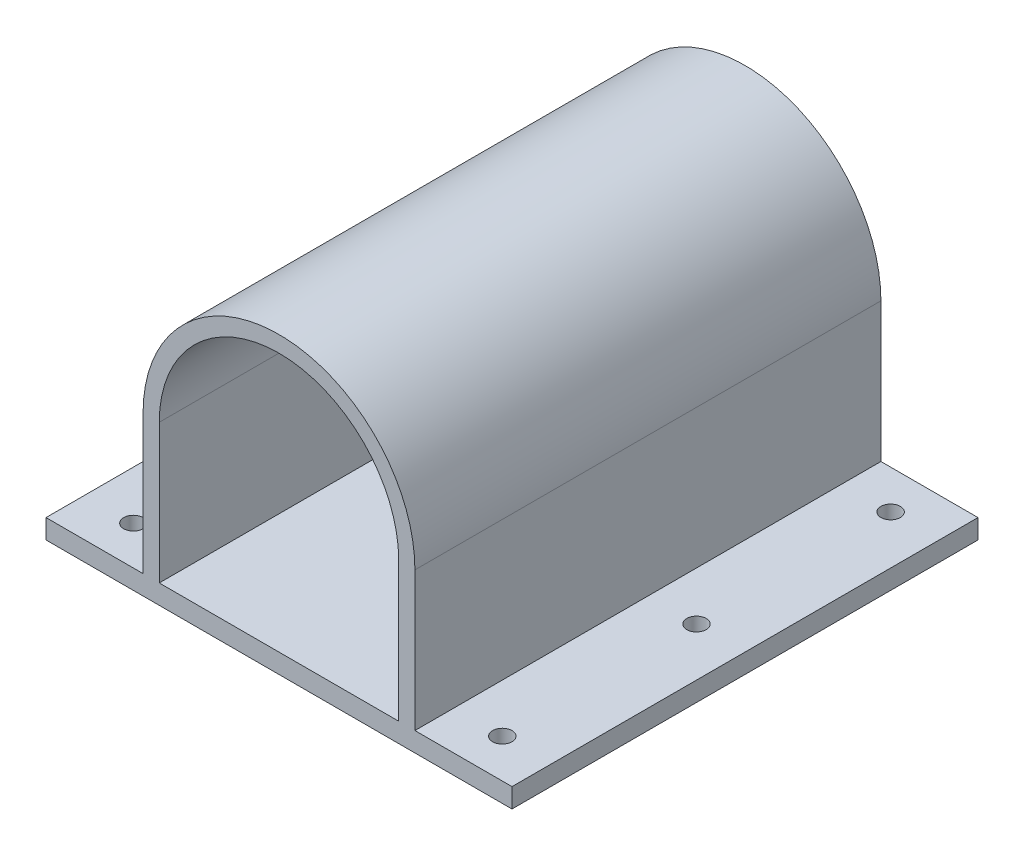
ISO-10303-21;
HEADER;
FILE_DESCRIPTION(('STEP AP214'),'2;1');
FILE_NAME('part.step','',(''),(''),'','','');
FILE_SCHEMA(('AUTOMOTIVE_DESIGN { 1 0 10303 214 1 1 1 1 }'));
ENDSEC;
DATA;
#1=APPLICATION_CONTEXT('core data for automotive mechanical design processes');
#2=APPLICATION_PROTOCOL_DEFINITION('international standard','automotive_design',2000,#1);
#3=PRODUCT_CONTEXT('',#1,'mechanical');
#4=PRODUCT('Part','Part','',(#3));
#5=PRODUCT_RELATED_PRODUCT_CATEGORY('part','',(#4));
#6=PRODUCT_DEFINITION_FORMATION('','',#4);
#7=PRODUCT_DEFINITION_CONTEXT('part definition',#1,'design');
#8=PRODUCT_DEFINITION('design','',#6,#7);
#9=PRODUCT_DEFINITION_SHAPE('','',#8);
#10=(LENGTH_UNIT() NAMED_UNIT(*) SI_UNIT(.MILLI.,.METRE.));
#11=(NAMED_UNIT(*) PLANE_ANGLE_UNIT() SI_UNIT($,.RADIAN.));
#12=(NAMED_UNIT(*) SI_UNIT($,.STERADIAN.) SOLID_ANGLE_UNIT());
#13=UNCERTAINTY_MEASURE_WITH_UNIT(LENGTH_MEASURE(1.E-05),#10,'distance_accuracy_value','');
#14=(GEOMETRIC_REPRESENTATION_CONTEXT(3) GLOBAL_UNCERTAINTY_ASSIGNED_CONTEXT((#13)) GLOBAL_UNIT_ASSIGNED_CONTEXT((#10,
#11,#12)) REPRESENTATION_CONTEXT('',''));
#15=CARTESIAN_POINT('',(0.,0.,0.));
#16=DIRECTION('',(0.,0.,1.));
#17=DIRECTION('',(1.,0.,0.));
#18=AXIS2_PLACEMENT_3D('',#15,#16,#17);
#19=CARTESIAN_POINT('',(0.,-15.5,72.));
#20=DIRECTION('',(0.,0.,-1.));
#21=DIRECTION('',(-1.,0.,0.));
#22=AXIS2_PLACEMENT_3D('',#19,#20,#21);
#23=CYLINDRICAL_SURFACE('',#22,1.65);
#24=CARTESIAN_POINT('',(0.,-15.5,0.));
#25=DIRECTION('',(0.,0.,1.));
#26=DIRECTION('',(1.,0.,0.));
#27=AXIS2_PLACEMENT_3D('',#24,#25,#26);
#28=CIRCLE('',#27,1.65);
#29=CARTESIAN_POINT('',(1.65000000000006,-15.5,0.));
#30=VERTEX_POINT('',#29);
#31=EDGE_CURVE('E216',#30,#30,#28,.T.);
#32=ORIENTED_EDGE('',*,*,#31,.F.);
#33=EDGE_LOOP('',(#32));
#34=FACE_BOUND('',#33,.T.);
#35=CARTESIAN_POINT('',(0.,-15.5,15.));
#36=DIRECTION('',(0.,0.,1.));
#37=DIRECTION('',(1.,0.,0.));
#38=AXIS2_PLACEMENT_3D('',#35,#36,#37);
#39=CIRCLE('',#38,1.65);
#40=CARTESIAN_POINT('',(1.65000000000006,-15.5,15.));
#41=VERTEX_POINT('',#40);
#42=EDGE_CURVE('E195',#41,#41,#39,.T.);
#43=ORIENTED_EDGE('',*,*,#42,.T.);
#44=EDGE_LOOP('',(#43));
#45=FACE_BOUND('',#44,.T.);
#46=ADVANCED_FACE('F39',(#34,#45),#23,.F.);
#47=CARTESIAN_POINT('',(-7.,0.,72.));
#48=DIRECTION('',(0.,0.,-1.));
#49=DIRECTION('',(-1.,0.,0.));
#50=AXIS2_PLACEMENT_3D('',#47,#48,#49);
#51=CYLINDRICAL_SURFACE('',#50,6.15);
#52=CARTESIAN_POINT('',(-7.,0.,0.));
#53=DIRECTION('',(0.,0.,1.));
#54=DIRECTION('',(1.,0.,0.));
#55=AXIS2_PLACEMENT_3D('',#52,#53,#54);
#56=CIRCLE('',#55,6.15);
#57=CARTESIAN_POINT('',(-0.85,0.,0.));
#58=VERTEX_POINT('',#57);
#59=EDGE_CURVE('E213',#58,#58,#56,.T.);
#60=ORIENTED_EDGE('',*,*,#59,.F.);
#61=EDGE_LOOP('',(#60));
#62=FACE_BOUND('',#61,.T.);
#63=CARTESIAN_POINT('',(-7.,0.,15.));
#64=DIRECTION('',(0.,0.,1.));
#65=DIRECTION('',(1.,0.,0.));
#66=AXIS2_PLACEMENT_3D('',#63,#64,#65);
#67=CIRCLE('',#66,6.15);
#68=CARTESIAN_POINT('',(-0.85,0.,15.));
#69=VERTEX_POINT('',#68);
#70=EDGE_CURVE('E192',#69,#69,#67,.T.);
#71=ORIENTED_EDGE('',*,*,#70,.T.);
#72=EDGE_LOOP('',(#71));
#73=FACE_BOUND('',#72,.T.);
#74=ADVANCED_FACE('F308',(#62,#73),#51,.F.);
#75=CARTESIAN_POINT('',(-13.4233937586588,-7.75000000000005,72.));
#76=DIRECTION('',(0.,0.,-1.));
#77=DIRECTION('',(-1.,0.,0.));
#78=AXIS2_PLACEMENT_3D('',#75,#76,#77);
#79=CYLINDRICAL_SURFACE('',#78,1.65);
#80=CARTESIAN_POINT('',(-13.4233937586588,-7.75000000000005,0.));
#81=DIRECTION('',(0.,0.,1.));
#82=DIRECTION('',(1.,0.,0.));
#83=AXIS2_PLACEMENT_3D('',#80,#81,#82);
#84=CIRCLE('',#83,1.65);
#85=CARTESIAN_POINT('',(-11.7733937586588,-7.75000000000005,0.));
#86=VERTEX_POINT('',#85);
#87=EDGE_CURVE('E210',#86,#86,#84,.T.);
#88=ORIENTED_EDGE('',*,*,#87,.F.);
#89=EDGE_LOOP('',(#88));
#90=FACE_BOUND('',#89,.T.);
#91=CARTESIAN_POINT('',(-13.4233937586588,-7.75000000000005,15.));
#92=DIRECTION('',(0.,0.,1.));
#93=DIRECTION('',(1.,0.,0.));
#94=AXIS2_PLACEMENT_3D('',#91,#92,#93);
#95=CIRCLE('',#94,1.65);
#96=CARTESIAN_POINT('',(-11.7733937586588,-7.75000000000005,15.));
#97=VERTEX_POINT('',#96);
#98=EDGE_CURVE('E189',#97,#97,#95,.T.);
#99=ORIENTED_EDGE('',*,*,#98,.T.);
#100=EDGE_LOOP('',(#99));
#101=FACE_BOUND('',#100,.T.);
#102=ADVANCED_FACE('F315',(#90,#101),#79,.F.);
#103=CARTESIAN_POINT('',(-13.4233937586588,7.74999999999994,72.));
#104=DIRECTION('',(0.,0.,-1.));
#105=DIRECTION('',(-1.,0.,0.));
#106=AXIS2_PLACEMENT_3D('',#103,#104,#105);
#107=CYLINDRICAL_SURFACE('',#106,1.65);
#108=CARTESIAN_POINT('',(-13.4233937586588,7.74999999999994,0.));
#109=DIRECTION('',(0.,0.,1.));
#110=DIRECTION('',(1.,0.,0.));
#111=AXIS2_PLACEMENT_3D('',#108,#109,#110);
#112=CIRCLE('',#111,1.65);
#113=CARTESIAN_POINT('',(-11.7733937586588,7.74999999999994,0.));
#114=VERTEX_POINT('',#113);
#115=EDGE_CURVE('E207',#114,#114,#112,.T.);
#116=ORIENTED_EDGE('',*,*,#115,.F.);
#117=EDGE_LOOP('',(#116));
#118=FACE_BOUND('',#117,.T.);
#119=CARTESIAN_POINT('',(-13.4233937586588,7.74999999999994,15.));
#120=DIRECTION('',(0.,0.,1.));
#121=DIRECTION('',(1.,0.,0.));
#122=AXIS2_PLACEMENT_3D('',#119,#120,#121);
#123=CIRCLE('',#122,1.65);
#124=CARTESIAN_POINT('',(-11.7733937586588,7.74999999999994,15.));
#125=VERTEX_POINT('',#124);
#126=EDGE_CURVE('E186',#125,#125,#123,.T.);
#127=ORIENTED_EDGE('',*,*,#126,.T.);
#128=EDGE_LOOP('',(#127));
#129=FACE_BOUND('',#128,.T.);
#130=ADVANCED_FACE('F420',(#118,#129),#107,.F.);
#131=CARTESIAN_POINT('',(0.,15.5,72.));
#132=DIRECTION('',(0.,0.,-1.));
#133=DIRECTION('',(-1.,0.,0.));
#134=AXIS2_PLACEMENT_3D('',#131,#132,#133);
#135=CYLINDRICAL_SURFACE('',#134,1.65);
#136=CARTESIAN_POINT('',(0.,15.5,0.));
#137=DIRECTION('',(0.,0.,1.));
#138=DIRECTION('',(1.,0.,0.));
#139=AXIS2_PLACEMENT_3D('',#136,#137,#138);
#140=CIRCLE('',#139,1.65);
#141=CARTESIAN_POINT('',(1.64999999999994,15.5,0.));
#142=VERTEX_POINT('',#141);
#143=EDGE_CURVE('E204',#142,#142,#140,.T.);
#144=ORIENTED_EDGE('',*,*,#143,.F.);
#145=EDGE_LOOP('',(#144));
#146=FACE_BOUND('',#145,.T.);
#147=CARTESIAN_POINT('',(0.,15.5,15.));
#148=DIRECTION('',(0.,0.,1.));
#149=DIRECTION('',(1.,0.,0.));
#150=AXIS2_PLACEMENT_3D('',#147,#148,#149);
#151=CIRCLE('',#150,1.65);
#152=CARTESIAN_POINT('',(1.64999999999994,15.5,15.));
#153=VERTEX_POINT('',#152);
#154=EDGE_CURVE('E183',#153,#153,#151,.T.);
#155=ORIENTED_EDGE('',*,*,#154,.T.);
#156=EDGE_LOOP('',(#155));
#157=FACE_BOUND('',#156,.T.);
#158=ADVANCED_FACE('F416',(#146,#157),#135,.F.);
#159=CARTESIAN_POINT('',(13.4233937586588,7.75000000000006,72.));
#160=DIRECTION('',(0.,0.,-1.));
#161=DIRECTION('',(-1.,0.,0.));
#162=AXIS2_PLACEMENT_3D('',#159,#160,#161);
#163=CYLINDRICAL_SURFACE('',#162,1.65);
#164=CARTESIAN_POINT('',(13.4233937586588,7.75000000000006,0.));
#165=DIRECTION('',(0.,0.,1.));
#166=DIRECTION('',(1.,0.,0.));
#167=AXIS2_PLACEMENT_3D('',#164,#165,#166);
#168=CIRCLE('',#167,1.65);
#169=CARTESIAN_POINT('',(15.0733937586588,7.75000000000006,0.));
#170=VERTEX_POINT('',#169);
#171=EDGE_CURVE('E201',#170,#170,#168,.T.);
#172=ORIENTED_EDGE('',*,*,#171,.F.);
#173=EDGE_LOOP('',(#172));
#174=FACE_BOUND('',#173,.T.);
#175=CARTESIAN_POINT('',(13.4233937586588,7.75000000000006,15.));
#176=DIRECTION('',(0.,0.,1.));
#177=DIRECTION('',(1.,0.,0.));
#178=AXIS2_PLACEMENT_3D('',#175,#176,#177);
#179=CIRCLE('',#178,1.65);
#180=CARTESIAN_POINT('',(15.0733937586588,7.75000000000006,15.));
#181=VERTEX_POINT('',#180);
#182=EDGE_CURVE('E180',#181,#181,#179,.T.);
#183=ORIENTED_EDGE('',*,*,#182,.T.);
#184=EDGE_LOOP('',(#183));
#185=FACE_BOUND('',#184,.T.);
#186=ADVANCED_FACE('F382',(#174,#185),#163,.F.);
#187=CARTESIAN_POINT('',(13.4233937586588,-7.74999999999995,72.));
#188=DIRECTION('',(0.,0.,-1.));
#189=DIRECTION('',(-1.,0.,0.));
#190=AXIS2_PLACEMENT_3D('',#187,#188,#189);
#191=CYLINDRICAL_SURFACE('',#190,1.65);
#192=CARTESIAN_POINT('',(13.4233937586588,-7.74999999999995,0.));
#193=DIRECTION('',(0.,0.,1.));
#194=DIRECTION('',(1.,0.,0.));
#195=AXIS2_PLACEMENT_3D('',#192,#193,#194);
#196=CIRCLE('',#195,1.65);
#197=CARTESIAN_POINT('',(15.0733937586588,-7.74999999999995,0.));
#198=VERTEX_POINT('',#197);
#199=EDGE_CURVE('E198',#198,#198,#196,.T.);
#200=ORIENTED_EDGE('',*,*,#199,.F.);
#201=EDGE_LOOP('',(#200));
#202=FACE_BOUND('',#201,.T.);
#203=CARTESIAN_POINT('',(13.4233937586588,-7.74999999999995,15.));
#204=DIRECTION('',(0.,0.,1.));
#205=DIRECTION('',(1.,0.,0.));
#206=AXIS2_PLACEMENT_3D('',#203,#204,#205);
#207=CIRCLE('',#206,1.65);
#208=CARTESIAN_POINT('',(15.0733937586588,-7.74999999999995,15.));
#209=VERTEX_POINT('',#208);
#210=EDGE_CURVE('E176',#209,#209,#207,.T.);
#211=ORIENTED_EDGE('',*,*,#210,.T.);
#212=EDGE_LOOP('',(#211));
#213=FACE_BOUND('',#212,.T.);
#214=ADVANCED_FACE('F325',(#202,#213),#191,.F.);
#215=CARTESIAN_POINT('',(0.,0.,72.));
#216=DIRECTION('',(0.,0.,1.));
#217=DIRECTION('',(1.,0.,0.));
#218=AXIS2_PLACEMENT_3D('',#215,#216,#217);
#219=PLANE('',#218);
#220=CARTESIAN_POINT('',(0.,0.,72.));
#221=DIRECTION('',(0.,0.,1.));
#222=DIRECTION('',(1.,0.,0.));
#223=AXIS2_PLACEMENT_3D('',#220,#221,#222);
#224=CIRCLE('',#223,18.5);
#225=CARTESIAN_POINT('',(18.5,0.,72.));
#226=VERTEX_POINT('',#225);
#227=CARTESIAN_POINT('',(-18.5,0.,72.));
#228=VERTEX_POINT('',#227);
#229=EDGE_CURVE('E140',#226,#228,#224,.T.);
#230=ORIENTED_EDGE('',*,*,#229,.F.);
#231=DIRECTION('',(0.,1.,0.));
#232=VECTOR('',#231,1.);
#233=CARTESIAN_POINT('',(18.5,-21.5,72.));
#234=LINE('',#233,#232);
#235=CARTESIAN_POINT('',(18.5,-21.5,72.));
#236=VERTEX_POINT('',#235);
#237=EDGE_CURVE('E157',#236,#226,#234,.T.);
#238=ORIENTED_EDGE('',*,*,#237,.F.);
#239=DIRECTION('',(1.,0.,0.));
#240=VECTOR('',#239,1.);
#241=CARTESIAN_POINT('',(-18.5,-21.5,72.));
#242=LINE('',#241,#240);
#243=CARTESIAN_POINT('',(-18.5,-21.5,72.));
#244=VERTEX_POINT('',#243);
#245=EDGE_CURVE('E160',#244,#236,#242,.T.);
#246=ORIENTED_EDGE('',*,*,#245,.F.);
#247=DIRECTION('',(0.,-1.,0.));
#248=VECTOR('',#247,1.);
#249=CARTESIAN_POINT('',(-18.5,0.,72.));
#250=LINE('',#249,#248);
#251=EDGE_CURVE('E169',#228,#244,#250,.T.);
#252=ORIENTED_EDGE('',*,*,#251,.F.);
#253=EDGE_LOOP('',(#230,#238,#246,#252));
#254=FACE_BOUND('',#253,.T.);
#255=CARTESIAN_POINT('',(0.,0.,72.));
#256=DIRECTION('',(0.,0.,1.));
#257=DIRECTION('',(1.,0.,0.));
#258=AXIS2_PLACEMENT_3D('',#255,#256,#257);
#259=CIRCLE('',#258,21.);
#260=CARTESIAN_POINT('',(21.,0.,72.));
#261=VERTEX_POINT('',#260);
#262=CARTESIAN_POINT('',(-21.,0.,72.));
#263=VERTEX_POINT('',#262);
#264=EDGE_CURVE('E220',#261,#263,#259,.T.);
#265=ORIENTED_EDGE('',*,*,#264,.T.);
#266=DIRECTION('',(0.,-1.,0.));
#267=VECTOR('',#266,1.);
#268=CARTESIAN_POINT('',(-21.,0.,72.));
#269=LINE('',#268,#267);
#270=CARTESIAN_POINT('',(-21.,-21.5,72.));
#271=VERTEX_POINT('',#270);
#272=EDGE_CURVE('E223',#263,#271,#269,.T.);
#273=ORIENTED_EDGE('',*,*,#272,.T.);
#274=DIRECTION('',(-1.,0.,0.));
#275=VECTOR('',#274,1.);
#276=CARTESIAN_POINT('',(-21.,-21.5,72.));
#277=LINE('',#276,#275);
#278=CARTESIAN_POINT('',(-36.,-21.5,72.));
#279=VERTEX_POINT('',#278);
#280=EDGE_CURVE('E226',#271,#279,#277,.T.);
#281=ORIENTED_EDGE('',*,*,#280,.T.);
#282=DIRECTION('',(0.,-1.,0.));
#283=VECTOR('',#282,1.);
#284=CARTESIAN_POINT('',(-36.,-21.5,72.));
#285=LINE('',#284,#283);
#286=CARTESIAN_POINT('',(-36.,-24.5,72.));
#287=VERTEX_POINT('',#286);
#288=EDGE_CURVE('E228',#279,#287,#285,.T.);
#289=ORIENTED_EDGE('',*,*,#288,.T.);
#290=DIRECTION('',(1.,0.,0.));
#291=VECTOR('',#290,1.);
#292=CARTESIAN_POINT('',(-36.,-24.5,72.));
#293=LINE('',#292,#291);
#294=CARTESIAN_POINT('',(36.,-24.5,72.));
#295=VERTEX_POINT('',#294);
#296=EDGE_CURVE('E230',#287,#295,#293,.T.);
#297=ORIENTED_EDGE('',*,*,#296,.T.);
#298=DIRECTION('',(0.,1.,0.));
#299=VECTOR('',#298,1.);
#300=CARTESIAN_POINT('',(36.,-24.5,72.));
#301=LINE('',#300,#299);
#302=CARTESIAN_POINT('',(36.,-21.5,72.));
#303=VERTEX_POINT('',#302);
#304=EDGE_CURVE('E232',#295,#303,#301,.T.);
#305=ORIENTED_EDGE('',*,*,#304,.T.);
#306=DIRECTION('',(-1.,0.,0.));
#307=VECTOR('',#306,1.);
#308=CARTESIAN_POINT('',(36.,-21.5,72.));
#309=LINE('',#308,#307);
#310=CARTESIAN_POINT('',(21.,-21.5,72.));
#311=VERTEX_POINT('',#310);
#312=EDGE_CURVE('E234',#303,#311,#309,.T.);
#313=ORIENTED_EDGE('',*,*,#312,.T.);
#314=DIRECTION('',(0.,1.,0.));
#315=VECTOR('',#314,1.);
#316=CARTESIAN_POINT('',(21.,-21.5,72.));
#317=LINE('',#316,#315);
#318=EDGE_CURVE('E236',#311,#261,#317,.T.);
#319=ORIENTED_EDGE('',*,*,#318,.T.);
#320=EDGE_LOOP('',(#265,#273,#281,#289,#297,#305,#313,#319));
#321=FACE_BOUND('',#320,.T.);
#322=ADVANCED_FACE('F292',(#254,#321),#219,.T.);
#323=CARTESIAN_POINT('',(0.,0.,0.));
#324=DIRECTION('',(0.,0.,1.));
#325=DIRECTION('',(1.,0.,0.));
#326=AXIS2_PLACEMENT_3D('',#323,#324,#325);
#327=PLANE('',#326);
#328=DIRECTION('',(1.,0.,0.));
#329=VECTOR('',#328,1.);
#330=CARTESIAN_POINT('',(-36.,-24.5,0.));
#331=LINE('',#330,#329);
#332=CARTESIAN_POINT('',(-30.,-24.5,0.));
#333=VERTEX_POINT('',#332);
#334=CARTESIAN_POINT('',(36.,-24.5,0.));
#335=VERTEX_POINT('',#334);
#336=EDGE_CURVE('E245',#333,#335,#331,.T.);
#337=ORIENTED_EDGE('',*,*,#336,.F.);
#338=DIRECTION('',(0.,-1.,0.));
#339=VECTOR('',#338,1.);
#340=CARTESIAN_POINT('',(-30.,0.,0.));
#341=LINE('',#340,#339);
#342=CARTESIAN_POINT('',(-30.,-21.5,0.));
#343=VERTEX_POINT('',#342);
#344=EDGE_CURVE('E47',#333,#343,#341,.F.);
#345=ORIENTED_EDGE('',*,*,#344,.T.);
#346=DIRECTION('',(-1.,0.,0.));
#347=VECTOR('',#346,1.);
#348=CARTESIAN_POINT('',(-21.,-21.5,0.));
#349=LINE('',#348,#347);
#350=CARTESIAN_POINT('',(-21.,-21.5,0.));
#351=VERTEX_POINT('',#350);
#352=EDGE_CURVE('E243',#351,#343,#349,.T.);
#353=ORIENTED_EDGE('',*,*,#352,.F.);
#354=DIRECTION('',(0.,-1.,0.));
#355=VECTOR('',#354,1.);
#356=CARTESIAN_POINT('',(-21.,0.,0.));
#357=LINE('',#356,#355);
#358=CARTESIAN_POINT('',(-21.,0.,0.));
#359=VERTEX_POINT('',#358);
#360=EDGE_CURVE('E241',#359,#351,#357,.T.);
#361=ORIENTED_EDGE('',*,*,#360,.F.);
#362=CARTESIAN_POINT('',(0.,0.,0.));
#363=DIRECTION('',(0.,0.,1.));
#364=DIRECTION('',(1.,0.,0.));
#365=AXIS2_PLACEMENT_3D('',#362,#363,#364);
#366=CIRCLE('',#365,21.);
#367=CARTESIAN_POINT('',(21.,0.,0.));
#368=VERTEX_POINT('',#367);
#369=EDGE_CURVE('E219',#368,#359,#366,.T.);
#370=ORIENTED_EDGE('',*,*,#369,.F.);
#371=DIRECTION('',(0.,1.,0.));
#372=VECTOR('',#371,1.);
#373=CARTESIAN_POINT('',(21.,-21.5,0.));
#374=LINE('',#373,#372);
#375=CARTESIAN_POINT('',(21.,-21.5,0.));
#376=VERTEX_POINT('',#375);
#377=EDGE_CURVE('E224',#376,#368,#374,.T.);
#378=ORIENTED_EDGE('',*,*,#377,.F.);
#379=DIRECTION('',(-1.,0.,0.));
#380=VECTOR('',#379,1.);
#381=CARTESIAN_POINT('',(36.,-21.5,0.));
#382=LINE('',#381,#380);
#383=CARTESIAN_POINT('',(36.,-21.5,0.));
#384=VERTEX_POINT('',#383);
#385=EDGE_CURVE('E249',#384,#376,#382,.T.);
#386=ORIENTED_EDGE('',*,*,#385,.F.);
#387=DIRECTION('',(0.,1.,0.));
#388=VECTOR('',#387,1.);
#389=CARTESIAN_POINT('',(36.,-24.5,0.));
#390=LINE('',#389,#388);
#391=EDGE_CURVE('E247',#335,#384,#390,.T.);
#392=ORIENTED_EDGE('',*,*,#391,.F.);
#393=EDGE_LOOP('',(#337,#345,#353,#361,#370,#378,#386,#392));
#394=FACE_BOUND('',#393,.T.);
#395=ORIENTED_EDGE('',*,*,#31,.T.);
#396=EDGE_LOOP('',(#395));
#397=FACE_BOUND('',#396,.T.);
#398=ORIENTED_EDGE('',*,*,#59,.T.);
#399=EDGE_LOOP('',(#398));
#400=FACE_BOUND('',#399,.T.);
#401=ORIENTED_EDGE('',*,*,#87,.T.);
#402=EDGE_LOOP('',(#401));
#403=FACE_BOUND('',#402,.T.);
#404=ORIENTED_EDGE('',*,*,#115,.T.);
#405=EDGE_LOOP('',(#404));
#406=FACE_BOUND('',#405,.T.);
#407=ORIENTED_EDGE('',*,*,#143,.T.);
#408=EDGE_LOOP('',(#407));
#409=FACE_BOUND('',#408,.T.);
#410=ORIENTED_EDGE('',*,*,#171,.T.);
#411=EDGE_LOOP('',(#410));
#412=FACE_BOUND('',#411,.T.);
#413=ORIENTED_EDGE('',*,*,#199,.T.);
#414=EDGE_LOOP('',(#413));
#415=FACE_BOUND('',#414,.T.);
#416=ADVANCED_FACE('F324',(#394,#397,#400,#403,#406,#409,#412,#415),#327,.F.);
#417=CARTESIAN_POINT('',(0.,0.,72.));
#418=DIRECTION('',(0.,0.,-1.));
#419=DIRECTION('',(-1.,0.,0.));
#420=AXIS2_PLACEMENT_3D('',#417,#418,#419);
#421=CYLINDRICAL_SURFACE('',#420,21.);
#422=ORIENTED_EDGE('',*,*,#369,.T.);
#423=DIRECTION('',(0.,0.,-1.));
#424=VECTOR('',#423,1.);
#425=CARTESIAN_POINT('',(-21.,0.,72.));
#426=LINE('',#425,#424);
#427=EDGE_CURVE('E271',#263,#359,#426,.T.);
#428=ORIENTED_EDGE('',*,*,#427,.F.);
#429=ORIENTED_EDGE('',*,*,#264,.F.);
#430=DIRECTION('',(0.,0.,-1.));
#431=VECTOR('',#430,1.);
#432=CARTESIAN_POINT('',(21.,0.,72.));
#433=LINE('',#432,#431);
#434=EDGE_CURVE('E238',#261,#368,#433,.T.);
#435=ORIENTED_EDGE('',*,*,#434,.T.);
#436=EDGE_LOOP('',(#422,#428,#429,#435));
#437=FACE_BOUND('',#436,.T.);
#438=ADVANCED_FACE('F329',(#437),#421,.T.);
#439=CARTESIAN_POINT('',(-21.,0.,72.));
#440=DIRECTION('',(1.,0.,0.));
#441=DIRECTION('',(0.,1.,0.));
#442=AXIS2_PLACEMENT_3D('',#439,#440,#441);
#443=PLANE('',#442);
#444=ORIENTED_EDGE('',*,*,#360,.T.);
#445=DIRECTION('',(0.,0.,-1.));
#446=VECTOR('',#445,1.);
#447=CARTESIAN_POINT('',(-21.,-21.5,72.));
#448=LINE('',#447,#446);
#449=EDGE_CURVE('E268',#271,#351,#448,.T.);
#450=ORIENTED_EDGE('',*,*,#449,.F.);
#451=ORIENTED_EDGE('',*,*,#272,.F.);
#452=ORIENTED_EDGE('',*,*,#427,.T.);
#453=EDGE_LOOP('',(#444,#450,#451,#452));
#454=FACE_BOUND('',#453,.T.);
#455=ADVANCED_FACE('F347',(#454),#443,.F.);
#456=CARTESIAN_POINT('',(-21.,-21.5,72.));
#457=DIRECTION('',(0.,-1.,0.));
#458=DIRECTION('',(0.,0.,-1.));
#459=AXIS2_PLACEMENT_3D('',#456,#457,#458);
#460=PLANE('',#459);
#461=CARTESIAN_POINT('',(-28.5,-21.5,6.));
#462=DIRECTION('',(0.,1.,0.));
#463=DIRECTION('',(0.,0.,1.));
#464=AXIS2_PLACEMENT_3D('',#461,#462,#463);
#465=CIRCLE('',#464,1.5);
#466=CARTESIAN_POINT('',(-28.5,-21.5,7.5));
#467=VERTEX_POINT('',#466);
#468=EDGE_CURVE('E626',#467,#467,#465,.T.);
#469=ORIENTED_EDGE('',*,*,#468,.F.);
#470=EDGE_LOOP('',(#469));
#471=FACE_BOUND('',#470,.T.);
#472=CARTESIAN_POINT('',(-28.5,-21.5,66.));
#473=DIRECTION('',(0.,1.,0.));
#474=DIRECTION('',(0.,0.,1.));
#475=AXIS2_PLACEMENT_3D('',#472,#473,#474);
#476=CIRCLE('',#475,1.5);
#477=CARTESIAN_POINT('',(-28.5,-21.5,67.5));
#478=VERTEX_POINT('',#477);
#479=EDGE_CURVE('E621',#478,#478,#476,.T.);
#480=ORIENTED_EDGE('',*,*,#479,.F.);
#481=EDGE_LOOP('',(#480));
#482=FACE_BOUND('',#481,.T.);
#483=CARTESIAN_POINT('',(-28.5,-21.5,36.));
#484=DIRECTION('',(0.,1.,0.));
#485=DIRECTION('',(0.,0.,1.));
#486=AXIS2_PLACEMENT_3D('',#483,#484,#485);
#487=CIRCLE('',#486,1.5);
#488=CARTESIAN_POINT('',(-28.5,-21.5,37.5));
#489=VERTEX_POINT('',#488);
#490=EDGE_CURVE('E163',#489,#489,#487,.T.);
#491=ORIENTED_EDGE('',*,*,#490,.F.);
#492=EDGE_LOOP('',(#491));
#493=FACE_BOUND('',#492,.T.);
#494=ORIENTED_EDGE('',*,*,#352,.T.);
#495=CARTESIAN_POINT('',(-30.,-21.5,6.00000000000001));
#496=DIRECTION('',(0.,-1.,0.));
#497=DIRECTION('',(0.,0.,-1.));
#498=AXIS2_PLACEMENT_3D('',#495,#496,#497);
#499=CIRCLE('',#498,6.);
#500=CARTESIAN_POINT('',(-36.,-21.5,6.00000000000001));
#501=VERTEX_POINT('',#500);
#502=EDGE_CURVE('E11',#343,#501,#499,.F.);
#503=ORIENTED_EDGE('',*,*,#502,.T.);
#504=DIRECTION('',(0.,0.,-1.));
#505=VECTOR('',#504,1.);
#506=CARTESIAN_POINT('',(-36.,-21.5,72.));
#507=LINE('',#506,#505);
#508=EDGE_CURVE('E265',#279,#501,#507,.T.);
#509=ORIENTED_EDGE('',*,*,#508,.F.);
#510=ORIENTED_EDGE('',*,*,#280,.F.);
#511=ORIENTED_EDGE('',*,*,#449,.T.);
#512=EDGE_LOOP('',(#494,#503,#509,#510,#511));
#513=FACE_BOUND('',#512,.T.);
#514=ADVANCED_FACE('F297',(#471,#482,#493,#513),#460,.F.);
#515=CARTESIAN_POINT('',(-36.,-21.5,72.));
#516=DIRECTION('',(1.,0.,0.));
#517=DIRECTION('',(0.,0.,-1.));
#518=AXIS2_PLACEMENT_3D('',#515,#516,#517);
#519=PLANE('',#518);
#520=ORIENTED_EDGE('',*,*,#508,.T.);
#521=DIRECTION('',(0.,-1.,0.));
#522=VECTOR('',#521,1.);
#523=CARTESIAN_POINT('',(-36.,-21.5,6.00000000000001));
#524=LINE('',#523,#522);
#525=CARTESIAN_POINT('',(-36.,-24.5,6.00000000000001));
#526=VERTEX_POINT('',#525);
#527=EDGE_CURVE('E274',#501,#526,#524,.T.);
#528=ORIENTED_EDGE('',*,*,#527,.T.);
#529=DIRECTION('',(0.,0.,-1.));
#530=VECTOR('',#529,1.);
#531=CARTESIAN_POINT('',(-36.,-24.5,72.));
#532=LINE('',#531,#530);
#533=EDGE_CURVE('E263',#287,#526,#532,.T.);
#534=ORIENTED_EDGE('',*,*,#533,.F.);
#535=ORIENTED_EDGE('',*,*,#288,.F.);
#536=EDGE_LOOP('',(#520,#528,#534,#535));
#537=FACE_BOUND('',#536,.T.);
#538=ADVANCED_FACE('F282',(#537),#519,.F.);
#539=CARTESIAN_POINT('',(-36.,-24.5,72.));
#540=DIRECTION('',(0.,1.,0.));
#541=DIRECTION('',(0.,0.,1.));
#542=AXIS2_PLACEMENT_3D('',#539,#540,#541);
#543=PLANE('',#542);
#544=CARTESIAN_POINT('',(-28.5,-24.5,6.));
#545=DIRECTION('',(0.,1.,0.));
#546=DIRECTION('',(0.,0.,1.));
#547=AXIS2_PLACEMENT_3D('',#544,#545,#546);
#548=CIRCLE('',#547,1.5);
#549=CARTESIAN_POINT('',(-28.5,-24.5,7.5));
#550=VERTEX_POINT('',#549);
#551=EDGE_CURVE('E623',#550,#550,#548,.T.);
#552=ORIENTED_EDGE('',*,*,#551,.T.);
#553=EDGE_LOOP('',(#552));
#554=FACE_BOUND('',#553,.T.);
#555=CARTESIAN_POINT('',(-28.5,-24.5,66.));
#556=DIRECTION('',(0.,1.,0.));
#557=DIRECTION('',(0.,0.,1.));
#558=AXIS2_PLACEMENT_3D('',#555,#556,#557);
#559=CIRCLE('',#558,1.5);
#560=CARTESIAN_POINT('',(-28.5,-24.5,67.5));
#561=VERTEX_POINT('',#560);
#562=EDGE_CURVE('E618',#561,#561,#559,.T.);
#563=ORIENTED_EDGE('',*,*,#562,.T.);
#564=EDGE_LOOP('',(#563));
#565=FACE_BOUND('',#564,.T.);
#566=CARTESIAN_POINT('',(28.5,-24.5,66.));
#567=DIRECTION('',(0.,1.,0.));
#568=DIRECTION('',(0.,0.,-1.));
#569=AXIS2_PLACEMENT_3D('',#566,#567,#568);
#570=CIRCLE('',#569,1.5);
#571=CARTESIAN_POINT('',(28.5,-24.5,64.5));
#572=VERTEX_POINT('',#571);
#573=EDGE_CURVE('E634',#572,#572,#570,.T.);
#574=ORIENTED_EDGE('',*,*,#573,.T.);
#575=EDGE_LOOP('',(#574));
#576=FACE_BOUND('',#575,.T.);
#577=CARTESIAN_POINT('',(28.5,-24.5,5.99999999999999));
#578=DIRECTION('',(0.,1.,0.));
#579=DIRECTION('',(0.,0.,-1.));
#580=AXIS2_PLACEMENT_3D('',#577,#578,#579);
#581=CIRCLE('',#580,1.5);
#582=CARTESIAN_POINT('',(28.5,-24.5,4.49999999999999));
#583=VERTEX_POINT('',#582);
#584=EDGE_CURVE('E640',#583,#583,#581,.T.);
#585=ORIENTED_EDGE('',*,*,#584,.T.);
#586=EDGE_LOOP('',(#585));
#587=FACE_BOUND('',#586,.T.);
#588=CARTESIAN_POINT('',(28.5,-24.5,36.));
#589=DIRECTION('',(0.,1.,0.));
#590=DIRECTION('',(0.,0.,-1.));
#591=AXIS2_PLACEMENT_3D('',#588,#589,#590);
#592=CIRCLE('',#591,1.5);
#593=CARTESIAN_POINT('',(28.5,-24.5,34.5));
#594=VERTEX_POINT('',#593);
#595=EDGE_CURVE('E653',#594,#594,#592,.T.);
#596=ORIENTED_EDGE('',*,*,#595,.T.);
#597=EDGE_LOOP('',(#596));
#598=FACE_BOUND('',#597,.T.);
#599=CARTESIAN_POINT('',(-28.5,-24.5,36.));
#600=DIRECTION('',(0.,1.,0.));
#601=DIRECTION('',(0.,0.,1.));
#602=AXIS2_PLACEMENT_3D('',#599,#600,#601);
#603=CIRCLE('',#602,1.5);
#604=CARTESIAN_POINT('',(-28.5,-24.5,37.5));
#605=VERTEX_POINT('',#604);
#606=EDGE_CURVE('E170',#605,#605,#603,.T.);
#607=ORIENTED_EDGE('',*,*,#606,.T.);
#608=EDGE_LOOP('',(#607));
#609=FACE_BOUND('',#608,.T.);
#610=ORIENTED_EDGE('',*,*,#533,.T.);
#611=CARTESIAN_POINT('',(-30.,-24.5,6.00000000000001));
#612=DIRECTION('',(0.,1.,0.));
#613=DIRECTION('',(0.,0.,1.));
#614=AXIS2_PLACEMENT_3D('',#611,#612,#613);
#615=CIRCLE('',#614,6.);
#616=EDGE_CURVE('E61',#526,#333,#615,.F.);
#617=ORIENTED_EDGE('',*,*,#616,.T.);
#618=ORIENTED_EDGE('',*,*,#336,.T.);
#619=DIRECTION('',(0.,0.,-1.));
#620=VECTOR('',#619,1.);
#621=CARTESIAN_POINT('',(36.,-24.5,72.));
#622=LINE('',#621,#620);
#623=EDGE_CURVE('E260',#295,#335,#622,.T.);
#624=ORIENTED_EDGE('',*,*,#623,.F.);
#625=ORIENTED_EDGE('',*,*,#296,.F.);
#626=EDGE_LOOP('',(#610,#617,#618,#624,#625));
#627=FACE_BOUND('',#626,.T.);
#628=ADVANCED_FACE('F288',(#554,#565,#576,#587,#598,#609,#627),#543,.F.);
#629=CARTESIAN_POINT('',(36.,-24.5,72.));
#630=DIRECTION('',(-1.,0.,0.));
#631=DIRECTION('',(0.,0.,1.));
#632=AXIS2_PLACEMENT_3D('',#629,#630,#631);
#633=PLANE('',#632);
#634=ORIENTED_EDGE('',*,*,#391,.T.);
#635=DIRECTION('',(0.,0.,-1.));
#636=VECTOR('',#635,1.);
#637=CARTESIAN_POINT('',(36.,-21.5,72.));
#638=LINE('',#637,#636);
#639=EDGE_CURVE('E257',#303,#384,#638,.T.);
#640=ORIENTED_EDGE('',*,*,#639,.F.);
#641=ORIENTED_EDGE('',*,*,#304,.F.);
#642=ORIENTED_EDGE('',*,*,#623,.T.);
#643=EDGE_LOOP('',(#634,#640,#641,#642));
#644=FACE_BOUND('',#643,.T.);
#645=ADVANCED_FACE('F336',(#644),#633,.F.);
#646=CARTESIAN_POINT('',(36.,-21.5,72.));
#647=DIRECTION('',(0.,-1.,0.));
#648=DIRECTION('',(0.,0.,-1.));
#649=AXIS2_PLACEMENT_3D('',#646,#647,#648);
#650=PLANE('',#649);
#651=CARTESIAN_POINT('',(28.5,-21.5,66.));
#652=DIRECTION('',(0.,1.,0.));
#653=DIRECTION('',(0.,0.,-1.));
#654=AXIS2_PLACEMENT_3D('',#651,#652,#653);
#655=CIRCLE('',#654,1.5);
#656=CARTESIAN_POINT('',(28.5,-21.5,64.5));
#657=VERTEX_POINT('',#656);
#658=EDGE_CURVE('E628',#657,#657,#655,.T.);
#659=ORIENTED_EDGE('',*,*,#658,.F.);
#660=EDGE_LOOP('',(#659));
#661=FACE_BOUND('',#660,.T.);
#662=CARTESIAN_POINT('',(28.5,-21.5,5.99999999999999));
#663=DIRECTION('',(0.,1.,0.));
#664=DIRECTION('',(0.,0.,-1.));
#665=AXIS2_PLACEMENT_3D('',#662,#663,#664);
#666=CIRCLE('',#665,1.5);
#667=CARTESIAN_POINT('',(28.5,-21.5,4.49999999999999));
#668=VERTEX_POINT('',#667);
#669=EDGE_CURVE('E637',#668,#668,#666,.T.);
#670=ORIENTED_EDGE('',*,*,#669,.F.);
#671=EDGE_LOOP('',(#670));
#672=FACE_BOUND('',#671,.T.);
#673=CARTESIAN_POINT('',(28.5,-21.5,36.));
#674=DIRECTION('',(0.,1.,0.));
#675=DIRECTION('',(0.,0.,-1.));
#676=AXIS2_PLACEMENT_3D('',#673,#674,#675);
#677=CIRCLE('',#676,1.5);
#678=CARTESIAN_POINT('',(28.5,-21.5,34.5));
#679=VERTEX_POINT('',#678);
#680=EDGE_CURVE('E642',#679,#679,#677,.T.);
#681=ORIENTED_EDGE('',*,*,#680,.F.);
#682=EDGE_LOOP('',(#681));
#683=FACE_BOUND('',#682,.T.);
#684=ORIENTED_EDGE('',*,*,#385,.T.);
#685=DIRECTION('',(0.,0.,-1.));
#686=VECTOR('',#685,1.);
#687=CARTESIAN_POINT('',(21.,-21.5,72.));
#688=LINE('',#687,#686);
#689=EDGE_CURVE('E254',#311,#376,#688,.T.);
#690=ORIENTED_EDGE('',*,*,#689,.F.);
#691=ORIENTED_EDGE('',*,*,#312,.F.);
#692=ORIENTED_EDGE('',*,*,#639,.T.);
#693=EDGE_LOOP('',(#684,#690,#691,#692));
#694=FACE_BOUND('',#693,.T.);
#695=ADVANCED_FACE('F332',(#661,#672,#683,#694),#650,.F.);
#696=CARTESIAN_POINT('',(21.,-21.5,72.));
#697=DIRECTION('',(-1.,0.,0.));
#698=DIRECTION('',(0.,-1.,0.));
#699=AXIS2_PLACEMENT_3D('',#696,#697,#698);
#700=PLANE('',#699);
#701=ORIENTED_EDGE('',*,*,#377,.T.);
#702=ORIENTED_EDGE('',*,*,#434,.F.);
#703=ORIENTED_EDGE('',*,*,#318,.F.);
#704=ORIENTED_EDGE('',*,*,#689,.T.);
#705=EDGE_LOOP('',(#701,#702,#703,#704));
#706=FACE_BOUND('',#705,.T.);
#707=ADVANCED_FACE('F330',(#706),#700,.F.);
#708=CARTESIAN_POINT('',(0.,0.,15.));
#709=DIRECTION('',(0.,0.,1.));
#710=DIRECTION('',(1.,0.,0.));
#711=AXIS2_PLACEMENT_3D('',#708,#709,#710);
#712=CYLINDRICAL_SURFACE('',#711,18.5);
#713=ORIENTED_EDGE('',*,*,#229,.T.);
#714=DIRECTION('',(0.,0.,1.));
#715=VECTOR('',#714,1.);
#716=CARTESIAN_POINT('',(-18.5,0.,15.));
#717=LINE('',#716,#715);
#718=CARTESIAN_POINT('',(-18.5,0.,15.));
#719=VERTEX_POINT('',#718);
#720=EDGE_CURVE('E133',#719,#228,#717,.T.);
#721=ORIENTED_EDGE('',*,*,#720,.F.);
#722=CARTESIAN_POINT('',(0.,0.,15.));
#723=DIRECTION('',(0.,0.,1.));
#724=DIRECTION('',(1.,0.,0.));
#725=AXIS2_PLACEMENT_3D('',#722,#723,#724);
#726=CIRCLE('',#725,18.5);
#727=CARTESIAN_POINT('',(18.5,0.,15.));
#728=VERTEX_POINT('',#727);
#729=EDGE_CURVE('E137',#728,#719,#726,.T.);
#730=ORIENTED_EDGE('',*,*,#729,.F.);
#731=DIRECTION('',(0.,0.,1.));
#732=VECTOR('',#731,1.);
#733=CARTESIAN_POINT('',(18.5,0.,15.));
#734=LINE('',#733,#732);
#735=EDGE_CURVE('E174',#728,#226,#734,.T.);
#736=ORIENTED_EDGE('',*,*,#735,.T.);
#737=EDGE_LOOP('',(#713,#721,#730,#736));
#738=FACE_BOUND('',#737,.T.);
#739=ADVANCED_FACE('F135',(#738),#712,.F.);
#740=CARTESIAN_POINT('',(18.5,-21.5,15.));
#741=DIRECTION('',(1.,0.,0.));
#742=DIRECTION('',(0.,1.,0.));
#743=AXIS2_PLACEMENT_3D('',#740,#741,#742);
#744=PLANE('',#743);
#745=ORIENTED_EDGE('',*,*,#237,.T.);
#746=ORIENTED_EDGE('',*,*,#735,.F.);
#747=DIRECTION('',(0.,1.,0.));
#748=VECTOR('',#747,1.);
#749=CARTESIAN_POINT('',(18.5,-21.5,15.));
#750=LINE('',#749,#748);
#751=CARTESIAN_POINT('',(18.5,-21.5,15.));
#752=VERTEX_POINT('',#751);
#753=EDGE_CURVE('E145',#752,#728,#750,.T.);
#754=ORIENTED_EDGE('',*,*,#753,.F.);
#755=DIRECTION('',(0.,0.,1.));
#756=VECTOR('',#755,1.);
#757=CARTESIAN_POINT('',(18.5,-21.5,15.));
#758=LINE('',#757,#756);
#759=EDGE_CURVE('E177',#752,#236,#758,.T.);
#760=ORIENTED_EDGE('',*,*,#759,.T.);
#761=EDGE_LOOP('',(#745,#746,#754,#760));
#762=FACE_BOUND('',#761,.T.);
#763=ADVANCED_FACE('F405',(#762),#744,.F.);
#764=CARTESIAN_POINT('',(-18.5,-21.5,15.));
#765=DIRECTION('',(0.,-1.,0.));
#766=DIRECTION('',(0.,0.,-1.));
#767=AXIS2_PLACEMENT_3D('',#764,#765,#766);
#768=PLANE('',#767);
#769=ORIENTED_EDGE('',*,*,#245,.T.);
#770=ORIENTED_EDGE('',*,*,#759,.F.);
#771=DIRECTION('',(1.,0.,0.));
#772=VECTOR('',#771,1.);
#773=CARTESIAN_POINT('',(-18.5,-21.5,15.));
#774=LINE('',#773,#772);
#775=CARTESIAN_POINT('',(-18.5,-21.5,15.));
#776=VERTEX_POINT('',#775);
#777=EDGE_CURVE('E153',#776,#752,#774,.T.);
#778=ORIENTED_EDGE('',*,*,#777,.F.);
#779=DIRECTION('',(0.,0.,1.));
#780=VECTOR('',#779,1.);
#781=CARTESIAN_POINT('',(-18.5,-21.5,15.));
#782=LINE('',#781,#780);
#783=EDGE_CURVE('E144',#776,#244,#782,.T.);
#784=ORIENTED_EDGE('',*,*,#783,.T.);
#785=EDGE_LOOP('',(#769,#770,#778,#784));
#786=FACE_BOUND('',#785,.T.);
#787=ADVANCED_FACE('F397',(#786),#768,.F.);
#788=CARTESIAN_POINT('',(-18.5,0.,15.));
#789=DIRECTION('',(-1.,0.,0.));
#790=DIRECTION('',(0.,-1.,0.));
#791=AXIS2_PLACEMENT_3D('',#788,#789,#790);
#792=PLANE('',#791);
#793=ORIENTED_EDGE('',*,*,#251,.T.);
#794=ORIENTED_EDGE('',*,*,#783,.F.);
#795=DIRECTION('',(0.,-1.,0.));
#796=VECTOR('',#795,1.);
#797=CARTESIAN_POINT('',(-18.5,0.,15.));
#798=LINE('',#797,#796);
#799=EDGE_CURVE('E148',#719,#776,#798,.T.);
#800=ORIENTED_EDGE('',*,*,#799,.F.);
#801=ORIENTED_EDGE('',*,*,#720,.T.);
#802=EDGE_LOOP('',(#793,#794,#800,#801));
#803=FACE_BOUND('',#802,.T.);
#804=ADVANCED_FACE('F149',(#803),#792,.F.);
#805=CARTESIAN_POINT('',(0.,0.,15.));
#806=DIRECTION('',(0.,0.,1.));
#807=DIRECTION('',(1.,0.,0.));
#808=AXIS2_PLACEMENT_3D('',#805,#806,#807);
#809=PLANE('',#808);
#810=ORIENTED_EDGE('',*,*,#42,.F.);
#811=EDGE_LOOP('',(#810));
#812=FACE_BOUND('',#811,.T.);
#813=ORIENTED_EDGE('',*,*,#70,.F.);
#814=EDGE_LOOP('',(#813));
#815=FACE_BOUND('',#814,.T.);
#816=ORIENTED_EDGE('',*,*,#98,.F.);
#817=EDGE_LOOP('',(#816));
#818=FACE_BOUND('',#817,.T.);
#819=ORIENTED_EDGE('',*,*,#126,.F.);
#820=EDGE_LOOP('',(#819));
#821=FACE_BOUND('',#820,.T.);
#822=ORIENTED_EDGE('',*,*,#154,.F.);
#823=EDGE_LOOP('',(#822));
#824=FACE_BOUND('',#823,.T.);
#825=ORIENTED_EDGE('',*,*,#182,.F.);
#826=EDGE_LOOP('',(#825));
#827=FACE_BOUND('',#826,.T.);
#828=ORIENTED_EDGE('',*,*,#210,.F.);
#829=EDGE_LOOP('',(#828));
#830=FACE_BOUND('',#829,.T.);
#831=ORIENTED_EDGE('',*,*,#729,.T.);
#832=ORIENTED_EDGE('',*,*,#799,.T.);
#833=ORIENTED_EDGE('',*,*,#777,.T.);
#834=ORIENTED_EDGE('',*,*,#753,.T.);
#835=EDGE_LOOP('',(#831,#832,#833,#834));
#836=FACE_BOUND('',#835,.T.);
#837=ADVANCED_FACE('F155',(#812,#815,#818,#821,#824,#827,#830,#836),#809,.T.);
#838=CARTESIAN_POINT('',(28.5,-24.5,36.));
#839=DIRECTION('',(0.,1.,0.));
#840=DIRECTION('',(0.,0.,1.));
#841=AXIS2_PLACEMENT_3D('',#838,#839,#840);
#842=CYLINDRICAL_SURFACE('',#841,1.5);
#843=ORIENTED_EDGE('',*,*,#595,.F.);
#844=EDGE_LOOP('',(#843));
#845=FACE_BOUND('',#844,.T.);
#846=ORIENTED_EDGE('',*,*,#680,.T.);
#847=EDGE_LOOP('',(#846));
#848=FACE_BOUND('',#847,.T.);
#849=ADVANCED_FACE('F387',(#845,#848),#842,.F.);
#850=CARTESIAN_POINT('',(28.5,-24.5,5.99999999999999));
#851=DIRECTION('',(0.,1.,0.));
#852=DIRECTION('',(0.,0.,1.));
#853=AXIS2_PLACEMENT_3D('',#850,#851,#852);
#854=CYLINDRICAL_SURFACE('',#853,1.5);
#855=ORIENTED_EDGE('',*,*,#584,.F.);
#856=EDGE_LOOP('',(#855));
#857=FACE_BOUND('',#856,.T.);
#858=ORIENTED_EDGE('',*,*,#669,.T.);
#859=EDGE_LOOP('',(#858));
#860=FACE_BOUND('',#859,.T.);
#861=ADVANCED_FACE('F394',(#857,#860),#854,.F.);
#862=CARTESIAN_POINT('',(28.5,-24.5,66.));
#863=DIRECTION('',(0.,1.,0.));
#864=DIRECTION('',(0.,0.,1.));
#865=AXIS2_PLACEMENT_3D('',#862,#863,#864);
#866=CYLINDRICAL_SURFACE('',#865,1.5);
#867=ORIENTED_EDGE('',*,*,#573,.F.);
#868=EDGE_LOOP('',(#867));
#869=FACE_BOUND('',#868,.T.);
#870=ORIENTED_EDGE('',*,*,#658,.T.);
#871=EDGE_LOOP('',(#870));
#872=FACE_BOUND('',#871,.T.);
#873=ADVANCED_FACE('F505',(#869,#872),#866,.F.);
#874=CARTESIAN_POINT('',(-28.5,-24.5,36.));
#875=DIRECTION('',(0.,1.,0.));
#876=DIRECTION('',(0.,0.,1.));
#877=AXIS2_PLACEMENT_3D('',#874,#875,#876);
#878=CYLINDRICAL_SURFACE('',#877,1.5);
#879=ORIENTED_EDGE('',*,*,#606,.F.);
#880=EDGE_LOOP('',(#879));
#881=FACE_BOUND('',#880,.T.);
#882=ORIENTED_EDGE('',*,*,#490,.T.);
#883=EDGE_LOOP('',(#882));
#884=FACE_BOUND('',#883,.T.);
#885=ADVANCED_FACE('F403',(#881,#884),#878,.F.);
#886=CARTESIAN_POINT('',(-28.5,-24.5,66.));
#887=DIRECTION('',(0.,1.,0.));
#888=DIRECTION('',(0.,0.,1.));
#889=AXIS2_PLACEMENT_3D('',#886,#887,#888);
#890=CYLINDRICAL_SURFACE('',#889,1.5);
#891=ORIENTED_EDGE('',*,*,#562,.F.);
#892=EDGE_LOOP('',(#891));
#893=FACE_BOUND('',#892,.T.);
#894=ORIENTED_EDGE('',*,*,#479,.T.);
#895=EDGE_LOOP('',(#894));
#896=FACE_BOUND('',#895,.T.);
#897=ADVANCED_FACE('F304',(#893,#896),#890,.F.);
#898=CARTESIAN_POINT('',(-28.5,-24.5,6.));
#899=DIRECTION('',(0.,1.,0.));
#900=DIRECTION('',(0.,0.,1.));
#901=AXIS2_PLACEMENT_3D('',#898,#899,#900);
#902=CYLINDRICAL_SURFACE('',#901,1.5);
#903=ORIENTED_EDGE('',*,*,#551,.F.);
#904=EDGE_LOOP('',(#903));
#905=FACE_BOUND('',#904,.T.);
#906=ORIENTED_EDGE('',*,*,#468,.T.);
#907=EDGE_LOOP('',(#906));
#908=FACE_BOUND('',#907,.T.);
#909=ADVANCED_FACE('F299',(#905,#908),#902,.F.);
#910=CARTESIAN_POINT('',(-30.,-21.5,6.00000000000001));
#911=DIRECTION('',(0.,-1.,0.));
#912=DIRECTION('',(0.,0.,-1.));
#913=AXIS2_PLACEMENT_3D('',#910,#911,#912);
#914=CYLINDRICAL_SURFACE('',#913,6.);
#915=ORIENTED_EDGE('',*,*,#502,.F.);
#916=ORIENTED_EDGE('',*,*,#344,.F.);
#917=ORIENTED_EDGE('',*,*,#616,.F.);
#918=ORIENTED_EDGE('',*,*,#527,.F.);
#919=EDGE_LOOP('',(#915,#916,#917,#918));
#920=FACE_BOUND('',#919,.T.);
#921=ADVANCED_FACE('F41',(#920),#914,.T.);
#922=CLOSED_SHELL('',(#46,#74,#102,#130,#158,#186,#214,#322,#416,#438,#455,#514,#538,#628,#645,
#695,#707,#739,#763,#787,#804,#837,#849,#861,#873,#885,#897,#909,#921));
#923=MANIFOLD_SOLID_BREP('B2',#922);
#924=ADVANCED_BREP_SHAPE_REPRESENTATION('',(#18,#923),#14);
#925=SHAPE_DEFINITION_REPRESENTATION(#9,#924);
ENDSEC;
END-ISO-10303-21;
